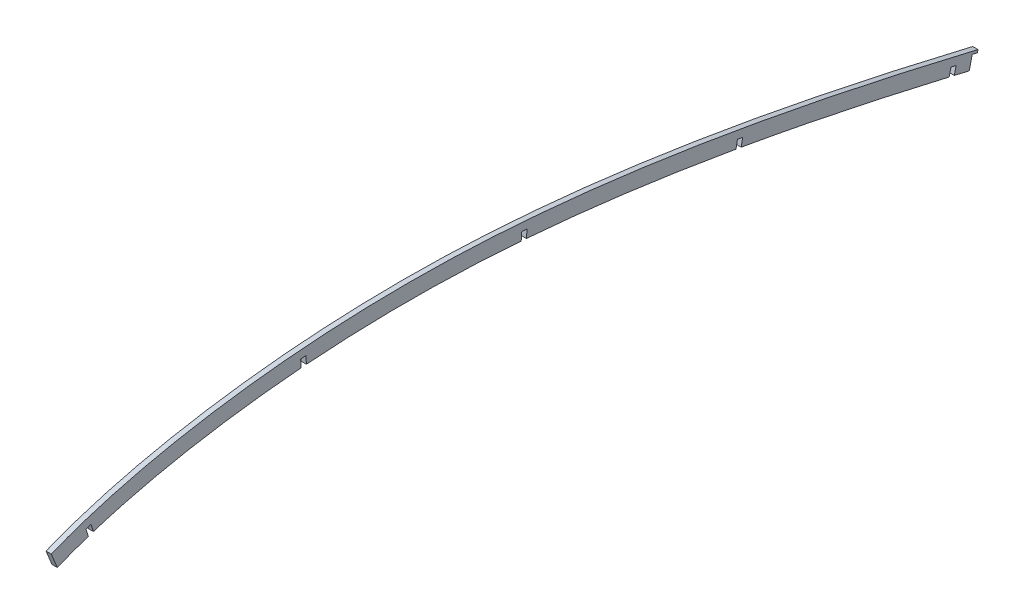
ISO-10303-21;
HEADER;
FILE_DESCRIPTION(('STEP AP214'),'2;1');
FILE_NAME('part.step','',(''),(''),'','','');
FILE_SCHEMA(('AUTOMOTIVE_DESIGN { 1 0 10303 214 1 1 1 1 }'));
ENDSEC;
DATA;
#1=APPLICATION_CONTEXT('core data for automotive mechanical design processes');
#2=APPLICATION_PROTOCOL_DEFINITION('international standard','automotive_design',2000,#1);
#3=PRODUCT_CONTEXT('',#1,'mechanical');
#4=PRODUCT('Part','Part','',(#3));
#5=PRODUCT_RELATED_PRODUCT_CATEGORY('part','',(#4));
#6=PRODUCT_DEFINITION_FORMATION('','',#4);
#7=PRODUCT_DEFINITION_CONTEXT('part definition',#1,'design');
#8=PRODUCT_DEFINITION('design','',#6,#7);
#9=PRODUCT_DEFINITION_SHAPE('','',#8);
#10=(LENGTH_UNIT() NAMED_UNIT(*) SI_UNIT(.MILLI.,.METRE.));
#11=(NAMED_UNIT(*) PLANE_ANGLE_UNIT() SI_UNIT($,.RADIAN.));
#12=(NAMED_UNIT(*) SI_UNIT($,.STERADIAN.) SOLID_ANGLE_UNIT());
#13=UNCERTAINTY_MEASURE_WITH_UNIT(LENGTH_MEASURE(1.E-05),#10,'distance_accuracy_value','');
#14=(GEOMETRIC_REPRESENTATION_CONTEXT(3) GLOBAL_UNCERTAINTY_ASSIGNED_CONTEXT((#13)) GLOBAL_UNIT_ASSIGNED_CONTEXT((#10,
#11,#12)) REPRESENTATION_CONTEXT('',''));
#15=CARTESIAN_POINT('',(0.,0.,0.));
#16=DIRECTION('',(0.,0.,1.));
#17=DIRECTION('',(1.,0.,0.));
#18=AXIS2_PLACEMENT_3D('',#15,#16,#17);
#19=CARTESIAN_POINT('',(4.7625,17.1396481702244,-615.081577013444));
#20=CARTESIAN_POINT('',(4.7625,17.324101761967,-614.31004075708));
#21=CARTESIAN_POINT('',(4.7625,17.6313826815989,-613.02272569901));
#22=CARTESIAN_POINT('',(4.7625,18.2487119662611,-610.429655878609));
#23=CARTESIAN_POINT('',(4.7625,18.9905644070783,-607.301737757551));
#24=CARTESIAN_POINT('',(4.7625,19.6676709186884,-604.430977557633));
#25=CARTESIAN_POINT('',(4.7625,20.0655873491199,-602.738206819214));
#26=CARTESIAN_POINT('',(4.7625,20.1864008165703,-602.223825862053));
#27=CARTESIAN_POINT('',(4.7625,20.3071495033727,-601.709433105989));
#28=CARTESIAN_POINT('',(4.7625,20.4278013713872,-601.19502045043));
#29=CARTESIAN_POINT('',(4.7625,20.5483560782246,-600.680587504561));
#30=CARTESIAN_POINT('',(4.7625,20.6688463598471,-600.166138967266));
#31=CARTESIAN_POINT('',(4.7625,24.9201900169082,-581.999059093585));
#32=CARTESIAN_POINT('',(4.7625,34.1506676923913,-540.919196670024));
#33=CARTESIAN_POINT('',(4.7625,42.3856818378709,-499.303273759449));
#34=CARTESIAN_POINT('',(4.7625,46.6511408456516,-475.243980176617));
#35=CARTESIAN_POINT('',(4.7625,46.8315584713001,-474.221657710415));
#36=CARTESIAN_POINT('',(4.7625,46.9231090372934,-473.701897287013));
#37=CARTESIAN_POINT('',(4.7625,47.0145431084058,-473.182121106492));
#38=CARTESIAN_POINT('',(4.7625,47.1058035969079,-472.66231773198));
#39=CARTESIAN_POINT('',(4.7625,47.1968899573277,-472.142487148665));
#40=CARTESIAN_POINT('',(4.7625,47.2878606822932,-471.622635441126));
#41=CARTESIAN_POINT('',(4.7625,51.0660147875698,-449.989624610276));
#42=CARTESIAN_POINT('',(4.7625,56.2328478898667,-416.816830973678));
#43=CARTESIAN_POINT('',(4.7625,61.2164451727462,-374.872019839903));
#44=CARTESIAN_POINT('',(4.7625,63.1548209798223,-353.995979819886));
#45=CARTESIAN_POINT('',(4.7625,63.9000628784314,-344.661445546551));
#46=CARTESIAN_POINT('',(4.7625,63.9416943909653,-344.13629062168));
#47=CARTESIAN_POINT('',(4.7625,63.983128432936,-343.611137310043));
#48=CARTESIAN_POINT('',(4.7625,64.0242662658889,-343.085972824958));
#49=CARTESIAN_POINT('',(4.7625,64.0651058861199,-342.560797287529));
#50=CARTESIAN_POINT('',(4.7625,64.1057441305605,-342.035604977305));
#51=CARTESIAN_POINT('',(4.7625,64.2453921107398,-340.217822045263));
#52=CARTESIAN_POINT('',(4.7625,65.2353132909809,-326.855067365178));
#53=CARTESIAN_POINT('',(4.7625,66.5731008453839,-302.084501399625));
#54=CARTESIAN_POINT('',(4.7625,67.0295113914138,-267.019938728509));
#55=CARTESIAN_POINT('',(4.7625,66.1868395413679,-237.191430937633));
#56=CARTESIAN_POINT('',(4.7625,65.0235561698412,-218.836761563478));
#57=CARTESIAN_POINT('',(4.7625,64.4961586650393,-212.001250995257));
#58=CARTESIAN_POINT('',(4.7625,64.4552929038934,-211.477067656619));
#59=CARTESIAN_POINT('',(4.7625,64.4141471078354,-210.952908875283));
#60=CARTESIAN_POINT('',(4.7625,64.3725811626279,-210.428784482618));
#61=CARTESIAN_POINT('',(4.7625,64.3305948952132,-209.904694861626));
#62=CARTESIAN_POINT('',(4.7625,64.2883286260672,-209.380627113175));
#63=CARTESIAN_POINT('',(4.7625,63.9408062613876,-205.114508770519));
#64=CARTESIAN_POINT('',(4.7625,62.5257172479679,-189.368914799697));
#65=CARTESIAN_POINT('',(4.7625,59.2266460994478,-162.355837104917));
#66=CARTESIAN_POINT('',(4.7625,54.2189832741619,-133.710472046701));
#67=CARTESIAN_POINT('',(4.7625,49.1352731501984,-111.101045047003));
#68=CARTESIAN_POINT('',(4.7625,45.269363386815,-96.4575401159779));
#69=CARTESIAN_POINT('',(4.7625,42.4990095916299,-87.2714812967859));
#70=CARTESIAN_POINT('',(4.7625,41.291624229938,-83.4946906040885));
#71=CARTESIAN_POINT('',(4.7625,41.13184165472,-82.9978032393506));
#72=CARTESIAN_POINT('',(4.7625,40.9715166419302,-82.5011777331781));
#73=CARTESIAN_POINT('',(4.7625,40.81035261586,-82.0048805211973));
#74=CARTESIAN_POINT('',(4.7625,40.6483417003848,-81.5089146046762));
#75=CARTESIAN_POINT('',(4.7625,40.485749442758,-81.0131312437216));
#76=CARTESIAN_POINT('',(4.7625,40.0952216405408,-79.8293397660172));
#77=CARTESIAN_POINT('',(4.7625,38.8298013612575,-76.0583495341878));
#78=CARTESIAN_POINT('',(4.7625,36.6322495027938,-69.8711355096253));
#79=CARTESIAN_POINT('',(4.7625,34.5747864106629,-64.588433246179));
#80=CARTESIAN_POINT('',(4.7625,33.4984403336222,-61.9608185824151));
#81=B_SPLINE_CURVE_WITH_KNOTS('',3,(#19,#20,#21,#22,#23,#24,#25,#26,#27,#28,#29,#30,#31,#32,#33,
#34,#35,#36,#37,#38,#39,#40,#41,#42,#43,#44,#45,#46,#47,#48,#49,#50,#51,#52,#53,#54,#55,#56,#57,
#58,#59,#60,#61,#62,#63,#64,#65,#66,#67,#68,#69,#70,#71,#72,#73,#74,#75,#76,#77,#78,#79,#80),
.UNSPECIFIED.,.F.,.F.,(4,1,1,1,1,1,1,1,1,1,1,1,1,1,1,1,1,1,1,1,1,1,1,1,1,1,1,1,1,1,1,1,1,1,1,1,
1,1,1,1,1,1,1,1,1,1,1,1,1,1,1,1,1,1,1,1,1,1,1,4),(0.235495016722039,0.238358810296295,
0.240268006012465,0.245112823152076,0.249957640291687,0.250910967115054,0.251387630526738,
0.251864293938422,0.252817620761789,0.253294295124641,0.253770969487493,0.254724310912419,
0.320624379271665,0.405753741821292,0.408077678674949,0.409032468228454,0.409509863005206,
0.409987257781958,0.410942047335462,0.411419458298466,0.411896869261471,0.412851680396645,
0.490883104370919,0.533447785645732,0.566036483443328,0.566993588228304,0.567472140620791,
0.567950693013279,0.568907797798254,0.569386403540351,0.569865009282448,0.570822185200236,
0.576012466920546,0.618577148195359,0.661141829470172,0.703706510744986,0.727290053126239,
0.72824955938757,0.728729312518236,0.729209065648901,0.730168571910233,0.730648333767204,
0.731128095624175,0.732087613520581,0.746271192019799,0.788835873294612,0.831400554569426,
0.852682895206832,0.873965235844239,0.887225542532381,0.888194158520526,0.888678466514598,
0.88916277450867,0.890131390496814,0.890615957659562,0.89110052482231,0.892069486368688,
0.895247576481646,0.905888746800349,0.916529917119052),.UNSPECIFIED.);
#82=DIRECTION('',(-1.,0.,0.));
#83=VECTOR('',#82,1.);
#84=SURFACE_OF_LINEAR_EXTRUSION('',#81,#83);
#85=CARTESIAN_POINT('',(1.5875,17.1396481702244,-615.081577013444));
#86=CARTESIAN_POINT('',(1.5875,17.324101761967,-614.31004075708));
#87=CARTESIAN_POINT('',(1.5875,17.6313826815989,-613.02272569901));
#88=CARTESIAN_POINT('',(1.5875,18.2487119662611,-610.429655878609));
#89=CARTESIAN_POINT('',(1.5875,18.9905644070783,-607.301737757551));
#90=CARTESIAN_POINT('',(1.5875,19.6676709186884,-604.430977557633));
#91=CARTESIAN_POINT('',(1.5875,20.0655873491199,-602.738206819214));
#92=CARTESIAN_POINT('',(1.5875,20.1864008165703,-602.223825862053));
#93=CARTESIAN_POINT('',(1.5875,20.3071495033727,-601.709433105989));
#94=CARTESIAN_POINT('',(1.5875,20.4278013713872,-601.19502045043));
#95=CARTESIAN_POINT('',(1.5875,20.5483560782246,-600.680587504561));
#96=CARTESIAN_POINT('',(1.5875,20.6688463598471,-600.166138967266));
#97=CARTESIAN_POINT('',(1.5875,24.9201900169082,-581.999059093585));
#98=CARTESIAN_POINT('',(1.5875,34.1506676923913,-540.919196670024));
#99=CARTESIAN_POINT('',(1.5875,42.3856818378709,-499.303273759449));
#100=CARTESIAN_POINT('',(1.5875,46.6511408456516,-475.243980176617));
#101=CARTESIAN_POINT('',(1.5875,46.8315584713001,-474.221657710415));
#102=CARTESIAN_POINT('',(1.5875,46.9231090372934,-473.701897287013));
#103=CARTESIAN_POINT('',(1.5875,47.0145431084058,-473.182121106492));
#104=CARTESIAN_POINT('',(1.5875,47.1058035969079,-472.66231773198));
#105=CARTESIAN_POINT('',(1.5875,47.1968899573277,-472.142487148665));
#106=CARTESIAN_POINT('',(1.5875,47.2878606822932,-471.622635441126));
#107=CARTESIAN_POINT('',(1.5875,51.0660147875698,-449.989624610276));
#108=CARTESIAN_POINT('',(1.5875,56.2328478898667,-416.816830973678));
#109=CARTESIAN_POINT('',(1.5875,61.2164451727462,-374.872019839903));
#110=CARTESIAN_POINT('',(1.5875,63.1548209798223,-353.995979819886));
#111=CARTESIAN_POINT('',(1.5875,63.9000628784314,-344.661445546551));
#112=CARTESIAN_POINT('',(1.5875,63.9416943909653,-344.13629062168));
#113=CARTESIAN_POINT('',(1.5875,63.983128432936,-343.611137310043));
#114=CARTESIAN_POINT('',(1.5875,64.0242662658889,-343.085972824958));
#115=CARTESIAN_POINT('',(1.5875,64.0651058861199,-342.560797287529));
#116=CARTESIAN_POINT('',(1.5875,64.1057441305605,-342.035604977305));
#117=CARTESIAN_POINT('',(1.5875,64.2453921107398,-340.217822045263));
#118=CARTESIAN_POINT('',(1.5875,65.2353132909809,-326.855067365178));
#119=CARTESIAN_POINT('',(1.5875,66.5731008453839,-302.084501399625));
#120=CARTESIAN_POINT('',(1.5875,67.0295113914138,-267.019938728509));
#121=CARTESIAN_POINT('',(1.5875,66.1868395413679,-237.191430937633));
#122=CARTESIAN_POINT('',(1.5875,65.0235561698412,-218.836761563478));
#123=CARTESIAN_POINT('',(1.5875,64.4961586650393,-212.001250995257));
#124=CARTESIAN_POINT('',(1.5875,64.4552929038934,-211.477067656619));
#125=CARTESIAN_POINT('',(1.5875,64.4141471078354,-210.952908875283));
#126=CARTESIAN_POINT('',(1.5875,64.3725811626279,-210.428784482618));
#127=CARTESIAN_POINT('',(1.5875,64.3305948952132,-209.904694861626));
#128=CARTESIAN_POINT('',(1.5875,64.2883286260672,-209.380627113175));
#129=CARTESIAN_POINT('',(1.5875,63.9408062613876,-205.114508770519));
#130=CARTESIAN_POINT('',(1.5875,62.5257172479679,-189.368914799697));
#131=CARTESIAN_POINT('',(1.5875,59.2266460994478,-162.355837104917));
#132=CARTESIAN_POINT('',(1.5875,54.2189832741619,-133.710472046701));
#133=CARTESIAN_POINT('',(1.5875,49.1352731501984,-111.101045047003));
#134=CARTESIAN_POINT('',(1.5875,45.269363386815,-96.4575401159779));
#135=CARTESIAN_POINT('',(1.5875,42.4990095916299,-87.2714812967859));
#136=CARTESIAN_POINT('',(1.5875,41.291624229938,-83.4946906040885));
#137=CARTESIAN_POINT('',(1.5875,41.13184165472,-82.9978032393506));
#138=CARTESIAN_POINT('',(1.5875,40.9715166419302,-82.5011777331781));
#139=CARTESIAN_POINT('',(1.5875,40.81035261586,-82.0048805211973));
#140=CARTESIAN_POINT('',(1.5875,40.6483417003848,-81.5089146046762));
#141=CARTESIAN_POINT('',(1.5875,40.485749442758,-81.0131312437216));
#142=CARTESIAN_POINT('',(1.5875,40.0952216405408,-79.8293397660172));
#143=CARTESIAN_POINT('',(1.5875,38.8298013612575,-76.0583495341878));
#144=CARTESIAN_POINT('',(1.5875,36.6322495027938,-69.8711355096253));
#145=CARTESIAN_POINT('',(1.5875,34.5747864106629,-64.588433246179));
#146=CARTESIAN_POINT('',(1.5875,33.4984403336222,-61.9608185824151));
#147=B_SPLINE_CURVE_WITH_KNOTS('',3,(#85,#86,#87,#88,#89,#90,#91,#92,#93,#94,#95,#96,#97,#98,
#99,#100,#101,#102,#103,#104,#105,#106,#107,#108,#109,#110,#111,#112,#113,#114,#115,#116,#117,
#118,#119,#120,#121,#122,#123,#124,#125,#126,#127,#128,#129,#130,#131,#132,#133,#134,#135,#136,
#137,#138,#139,#140,#141,#142,#143,#144,#145,#146),.UNSPECIFIED.,.F.,.F.,(4,1,1,1,1,1,1,1,1,1,1,
1,1,1,1,1,1,1,1,1,1,1,1,1,1,1,1,1,1,1,1,1,1,1,1,1,1,1,1,1,1,1,1,1,1,1,1,1,1,1,1,1,1,1,1,1,1,1,1,
4),(0.235495016722039,0.238358810296295,0.240268006012465,0.245112823152076,0.249957640291687,
0.250910967115054,0.251387630526738,0.251864293938422,0.252817620761789,0.253294295124641,
0.253770969487493,0.254724310912419,0.320624379271665,0.405753741821292,0.408077678674949,
0.409032468228454,0.409509863005206,0.409987257781958,0.410942047335462,0.411419458298466,
0.411896869261471,0.412851680396645,0.490883104370919,0.533447785645732,0.566036483443328,
0.566993588228304,0.567472140620791,0.567950693013279,0.568907797798254,0.569386403540351,
0.569865009282448,0.570822185200236,0.576012466920546,0.618577148195359,0.661141829470172,
0.703706510744986,0.727290053126239,0.72824955938757,0.728729312518236,0.729209065648901,
0.730168571910233,0.730648333767204,0.731128095624175,0.732087613520581,0.746271192019799,
0.788835873294612,0.831400554569426,0.852682895206832,0.873965235844239,0.887225542532381,
0.888194158520526,0.888678466514598,0.88916277450867,0.890131390496814,0.890615957659562,
0.89110052482231,0.892069486368688,0.895247576481646,0.905888746800349,0.916529917119052),.UNSPECIFIED.);
#148=CARTESIAN_POINT('',(1.5875,17.8764365250896,-611.993248956608));
#149=VERTEX_POINT('',#148);
#150=CARTESIAN_POINT('',(1.5875,20.0051241463908,-602.995386693206));
#151=VERTEX_POINT('',#150);
#152=EDGE_CURVE('E236',#149,#151,#147,.T.);
#153=ORIENTED_EDGE('',*,*,#152,.F.);
#154=DIRECTION('',(-1.,0.,0.));
#155=VECTOR('',#154,1.);
#156=CARTESIAN_POINT('',(4.7625,17.8764365250896,-611.993248956608));
#157=LINE('',#156,#155);
#158=CARTESIAN_POINT('',(4.7625,17.8764365250896,-611.993248956608));
#159=VERTEX_POINT('',#158);
#160=EDGE_CURVE('E11',#159,#149,#157,.T.);
#161=ORIENTED_EDGE('',*,*,#160,.F.);
#162=CARTESIAN_POINT('',(4.7625,20.0051241463908,-602.995386693206));
#163=VERTEX_POINT('',#162);
#164=EDGE_CURVE('E309',#159,#163,#81,.T.);
#165=ORIENTED_EDGE('',*,*,#164,.T.);
#166=DIRECTION('',(-1.,0.,0.));
#167=VECTOR('',#166,1.);
#168=CARTESIAN_POINT('',(4.7625,20.0051241463908,-602.995386693206));
#169=LINE('',#168,#167);
#170=EDGE_CURVE('E140',#163,#151,#169,.T.);
#171=ORIENTED_EDGE('',*,*,#170,.T.);
#172=EDGE_LOOP('',(#153,#161,#165,#171));
#173=FACE_BOUND('',#172,.T.);
#174=ADVANCED_FACE('F35',(#173),#84,.T.);
#175=CARTESIAN_POINT('',(4.7625,-137.434214768461,-574.862644619207));
#176=DIRECTION('',(0.,-0.232520498212296,-0.972591495907252));
#177=DIRECTION('',(0.,0.972591495907252,-0.232520498212296));
#178=AXIS2_PLACEMENT_3D('',#175,#176,#177);
#179=PLANE('',#178);
#180=DIRECTION('',(0.,-0.972591495907252,0.232520498212296));
#181=VECTOR('',#180,1.);
#182=CARTESIAN_POINT('',(1.5875,-137.434214768461,-574.862644619207));
#183=LINE('',#182,#181);
#184=CARTESIAN_POINT('',(1.5875,25.5978457508124,-613.839230468497));
#185=VERTEX_POINT('',#184);
#186=EDGE_CURVE('E241',#185,#149,#183,.T.);
#187=ORIENTED_EDGE('',*,*,#186,.F.);
#188=DIRECTION('',(-1.,0.,0.));
#189=VECTOR('',#188,1.);
#190=CARTESIAN_POINT('',(4.7625,25.5978457508124,-613.839230468497));
#191=LINE('',#190,#189);
#192=CARTESIAN_POINT('',(4.7625,25.5978457508124,-613.839230468497));
#193=VERTEX_POINT('',#192);
#194=EDGE_CURVE('E44',#193,#185,#191,.T.);
#195=ORIENTED_EDGE('',*,*,#194,.F.);
#196=DIRECTION('',(0.,-0.972591495907252,0.232520498212296));
#197=VECTOR('',#196,1.);
#198=CARTESIAN_POINT('',(4.7625,-137.434214768461,-574.862644619207));
#199=LINE('',#198,#197);
#200=EDGE_CURVE('E374',#193,#159,#199,.T.);
#201=ORIENTED_EDGE('',*,*,#200,.T.);
#202=ORIENTED_EDGE('',*,*,#160,.T.);
#203=EDGE_LOOP('',(#187,#195,#201,#202));
#204=FACE_BOUND('',#203,.T.);
#205=ADVANCED_FACE('F37',(#204),#179,.T.);
#206=CARTESIAN_POINT('',(4.7625,163.032060519282,-38.9765858492951));
#207=DIRECTION('',(0.,-0.972591495907248,0.232520498212311));
#208=DIRECTION('',(0.,-0.232520498212312,-0.972591495907248));
#209=AXIS2_PLACEMENT_3D('',#206,#207,#208);
#210=PLANE('',#209);
#211=DIRECTION('',(0.,0.232520498212311,0.972591495907248));
#212=VECTOR('',#211,1.);
#213=CARTESIAN_POINT('',(1.5875,163.032060519282,-38.9765858492951));
#214=LINE('',#213,#212);
#215=CARTESIAN_POINT('',(1.5875,24.8595931689883,-616.927208468003));
#216=VERTEX_POINT('',#215);
#217=EDGE_CURVE('E249',#216,#185,#214,.T.);
#218=ORIENTED_EDGE('',*,*,#217,.F.);
#219=DIRECTION('',(-1.,0.,0.));
#220=VECTOR('',#219,1.);
#221=CARTESIAN_POINT('',(4.7625,24.8595931689883,-616.927208468003));
#222=LINE('',#221,#220);
#223=CARTESIAN_POINT('',(4.7625,24.8595931689883,-616.927208468003));
#224=VERTEX_POINT('',#223);
#225=EDGE_CURVE('E352',#224,#216,#222,.T.);
#226=ORIENTED_EDGE('',*,*,#225,.F.);
#227=DIRECTION('',(0.,0.232520498212311,0.972591495907248));
#228=VECTOR('',#227,1.);
#229=CARTESIAN_POINT('',(4.7625,163.032060519282,-38.9765858492951));
#230=LINE('',#229,#228);
#231=EDGE_CURVE('E359',#224,#193,#230,.T.);
#232=ORIENTED_EDGE('',*,*,#231,.T.);
#233=ORIENTED_EDGE('',*,*,#194,.T.);
#234=EDGE_LOOP('',(#218,#226,#232,#233));
#235=FACE_BOUND('',#234,.T.);
#236=ADVANCED_FACE('F357',(#235),#210,.T.);
#237=CARTESIAN_POINT('',(4.7625,-138.172467350251,-577.950622618732));
#238=DIRECTION('',(0.,-0.232520498212234,-0.972591495907267));
#239=DIRECTION('',(0.,0.972591495907267,-0.232520498212234));
#240=AXIS2_PLACEMENT_3D('',#237,#238,#239);
#241=PLANE('',#240);
#242=DIRECTION('',(0.,-0.972591495907267,0.232520498212234));
#243=VECTOR('',#242,1.);
#244=CARTESIAN_POINT('',(1.5875,-138.172467350251,-577.950622618732));
#245=LINE('',#244,#243);
#246=CARTESIAN_POINT('',(1.5875,26.4035821687411,-617.296334758915));
#247=VERTEX_POINT('',#246);
#248=EDGE_CURVE('E252',#247,#216,#245,.T.);
#249=ORIENTED_EDGE('',*,*,#248,.F.);
#250=DIRECTION('',(-1.,0.,0.));
#251=VECTOR('',#250,1.);
#252=CARTESIAN_POINT('',(4.7625,26.4035821687411,-617.296334758915));
#253=LINE('',#252,#251);
#254=CARTESIAN_POINT('',(4.7625,26.4035821687411,-617.296334758915));
#255=VERTEX_POINT('',#254);
#256=EDGE_CURVE('E350',#255,#247,#253,.T.);
#257=ORIENTED_EDGE('',*,*,#256,.F.);
#258=DIRECTION('',(0.,-0.972591495907267,0.232520498212234));
#259=VECTOR('',#258,1.);
#260=CARTESIAN_POINT('',(4.7625,-138.172467350251,-577.950622618732));
#261=LINE('',#260,#259);
#262=EDGE_CURVE('E373',#255,#224,#261,.T.);
#263=ORIENTED_EDGE('',*,*,#262,.T.);
#264=ORIENTED_EDGE('',*,*,#225,.T.);
#265=EDGE_LOOP('',(#249,#257,#263,#264));
#266=FACE_BOUND('',#265,.T.);
#267=ADVANCED_FACE('F369',(#266),#241,.T.);
#268=CARTESIAN_POINT('',(4.7625,26.4035821687409,-617.296334758916));
#269=CARTESIAN_POINT('',(4.7625,26.9085124824443,-615.18430191489));
#270=CARTESIAN_POINT('',(4.7625,27.9142873331992,-610.959288876388));
#271=CARTESIAN_POINT('',(4.7625,32.8296317764442,-590.127541527268));
#272=CARTESIAN_POINT('',(4.7625,40.9138550143784,-554.428003339115));
#273=CARTESIAN_POINT('',(4.7625,51.3185939323861,-503.686138005634));
#274=CARTESIAN_POINT('',(4.7625,60.4658299911952,-452.392596730844));
#275=CARTESIAN_POINT('',(4.7625,67.9850158715227,-400.843471228535));
#276=CARTESIAN_POINT('',(4.7625,72.589063506653,-357.679132334803));
#277=CARTESIAN_POINT('',(4.7625,75.0502992601972,-323.056220781977));
#278=CARTESIAN_POINT('',(4.7625,76.5084412814493,-288.383000879313));
#279=CARTESIAN_POINT('',(4.7625,76.4258344387279,-253.666561863253));
#280=CARTESIAN_POINT('',(4.7625,74.7030652583376,-219.009987110002));
#281=CARTESIAN_POINT('',(4.7625,72.5121701681067,-193.082327137128));
#282=CARTESIAN_POINT('',(4.7625,69.4104125606429,-167.246128756063));
#283=CARTESIAN_POINT('',(4.7625,65.3542372922387,-141.548940999441));
#284=CARTESIAN_POINT('',(4.7625,60.2087185191181,-116.056003419049));
#285=CARTESIAN_POINT('',(4.7625,54.8510338693566,-95.0650929293049));
#286=CARTESIAN_POINT('',(4.7625,49.7752792079317,-78.5122882334403));
#287=CARTESIAN_POINT('',(4.7625,46.3494860287796,-68.6760823858227));
#288=CARTESIAN_POINT('',(4.7625,43.7825244258323,-61.9863205400274));
#289=CARTESIAN_POINT('',(4.7625,42.7219223278424,-59.3495011227662));
#290=CARTESIAN_POINT('',(4.7625,42.3126133502946,-58.3502813603158));
#291=B_SPLINE_CURVE_WITH_KNOTS('',3,(#268,#269,#270,#271,#272,#273,#274,#275,#276,#277,#278,
#279,#280,#281,#282,#283,#284,#285,#286,#287,#288,#289,#290),.UNSPECIFIED.,.F.,.F.,(4,1,1,1,1,1,
1,1,1,1,1,1,1,1,1,1,1,1,1,1,4),(0.235495016722039,0.24330751672204,0.25112001672204,0.3125,
0.375,0.4375,0.5,0.5625,0.59375,0.625,0.6875,0.71875,0.75,0.78125,0.8125,0.84375,0.875,0.890625,
0.90625,0.912623667119052,0.916529917119052),.UNSPECIFIED.);
#292=DIRECTION('',(-1.,0.,0.));
#293=VECTOR('',#292,1.);
#294=SURFACE_OF_LINEAR_EXTRUSION('',#291,#293);
#295=CARTESIAN_POINT('',(1.5875,26.4035821687409,-617.296334758916));
#296=CARTESIAN_POINT('',(1.5875,26.9085124824443,-615.18430191489));
#297=CARTESIAN_POINT('',(1.5875,27.9142873331992,-610.959288876388));
#298=CARTESIAN_POINT('',(1.5875,32.8296317764442,-590.127541527268));
#299=CARTESIAN_POINT('',(1.5875,40.9138550143784,-554.428003339115));
#300=CARTESIAN_POINT('',(1.5875,51.3185939323861,-503.686138005634));
#301=CARTESIAN_POINT('',(1.5875,60.4658299911952,-452.392596730844));
#302=CARTESIAN_POINT('',(1.5875,67.9850158715227,-400.843471228535));
#303=CARTESIAN_POINT('',(1.5875,72.589063506653,-357.679132334803));
#304=CARTESIAN_POINT('',(1.5875,75.0502992601972,-323.056220781977));
#305=CARTESIAN_POINT('',(1.5875,76.5084412814493,-288.383000879313));
#306=CARTESIAN_POINT('',(1.5875,76.4258344387279,-253.666561863253));
#307=CARTESIAN_POINT('',(1.5875,74.7030652583376,-219.009987110002));
#308=CARTESIAN_POINT('',(1.5875,72.5121701681067,-193.082327137128));
#309=CARTESIAN_POINT('',(1.5875,69.4104125606429,-167.246128756063));
#310=CARTESIAN_POINT('',(1.5875,65.3542372922387,-141.548940999441));
#311=CARTESIAN_POINT('',(1.5875,60.2087185191181,-116.056003419049));
#312=CARTESIAN_POINT('',(1.5875,54.8510338693566,-95.0650929293049));
#313=CARTESIAN_POINT('',(1.5875,49.7752792079317,-78.5122882334403));
#314=CARTESIAN_POINT('',(1.5875,46.3494860287796,-68.6760823858227));
#315=CARTESIAN_POINT('',(1.5875,43.7825244258323,-61.9863205400274));
#316=CARTESIAN_POINT('',(1.5875,42.7219223278424,-59.3495011227662));
#317=CARTESIAN_POINT('',(1.5875,42.3126133502946,-58.3502813603158));
#318=B_SPLINE_CURVE_WITH_KNOTS('',3,(#295,#296,#297,#298,#299,#300,#301,#302,#303,#304,#305,
#306,#307,#308,#309,#310,#311,#312,#313,#314,#315,#316,#317),.UNSPECIFIED.,.F.,.F.,(4,1,1,1,1,1,
1,1,1,1,1,1,1,1,1,1,1,1,1,1,4),(0.235495016722039,0.24330751672204,0.25112001672204,0.3125,
0.375,0.4375,0.5,0.5625,0.59375,0.625,0.6875,0.71875,0.75,0.78125,0.8125,0.84375,0.875,0.890625,
0.90625,0.912623667119052,0.916529917119052),.UNSPECIFIED.);
#319=CARTESIAN_POINT('',(1.5875,42.3126133502946,-58.3502813603158));
#320=VERTEX_POINT('',#319);
#321=EDGE_CURVE('E255',#247,#320,#318,.T.);
#322=ORIENTED_EDGE('',*,*,#321,.T.);
#323=DIRECTION('',(-1.,0.,0.));
#324=VECTOR('',#323,1.);
#325=CARTESIAN_POINT('',(4.7625,42.3126133502946,-58.3502813603158));
#326=LINE('',#325,#324);
#327=CARTESIAN_POINT('',(4.7625,42.3126133502946,-58.3502813603158));
#328=VERTEX_POINT('',#327);
#329=EDGE_CURVE('E347',#328,#320,#326,.T.);
#330=ORIENTED_EDGE('',*,*,#329,.F.);
#331=EDGE_CURVE('E376',#255,#328,#291,.T.);
#332=ORIENTED_EDGE('',*,*,#331,.F.);
#333=ORIENTED_EDGE('',*,*,#256,.T.);
#334=EDGE_LOOP('',(#322,#330,#332,#333));
#335=FACE_BOUND('',#334,.T.);
#336=ADVANCED_FACE('F391',(#335),#294,.F.);
#337=CARTESIAN_POINT('',(4.7625,26.5472940564943,-64.8082067970955));
#338=DIRECTION('',(0.,0.37905902594218,-0.925372495188703));
#339=DIRECTION('',(0.,0.925372495188703,0.37905902594218));
#340=AXIS2_PLACEMENT_3D('',#337,#338,#339);
#341=PLANE('',#340);
#342=DIRECTION('',(0.,-0.925372495188703,-0.37905902594218));
#343=VECTOR('',#342,1.);
#344=CARTESIAN_POINT('',(1.5875,26.5472940564943,-64.8082067970955));
#345=LINE('',#344,#343);
#346=CARTESIAN_POINT('',(1.5875,33.4984403336222,-61.9608185824151));
#347=VERTEX_POINT('',#346);
#348=EDGE_CURVE('E259',#320,#347,#345,.T.);
#349=ORIENTED_EDGE('',*,*,#348,.T.);
#350=DIRECTION('',(-1.,0.,0.));
#351=VECTOR('',#350,1.);
#352=CARTESIAN_POINT('',(4.7625,33.4984403336222,-61.9608185824151));
#353=LINE('',#352,#351);
#354=CARTESIAN_POINT('',(4.7625,33.4984403336222,-61.9608185824151));
#355=VERTEX_POINT('',#354);
#356=EDGE_CURVE('E345',#355,#347,#353,.T.);
#357=ORIENTED_EDGE('',*,*,#356,.F.);
#358=DIRECTION('',(0.,-0.925372495188703,-0.37905902594218));
#359=VECTOR('',#358,1.);
#360=CARTESIAN_POINT('',(4.7625,26.5472940564943,-64.8082067970955));
#361=LINE('',#360,#359);
#362=EDGE_CURVE('E385',#328,#355,#361,.T.);
#363=ORIENTED_EDGE('',*,*,#362,.F.);
#364=ORIENTED_EDGE('',*,*,#329,.T.);
#365=EDGE_LOOP('',(#349,#357,#363,#364));
#366=FACE_BOUND('',#365,.T.);
#367=ADVANCED_FACE('F395',(#366),#341,.F.);
#368=CARTESIAN_POINT('',(1.5875,40.4039717377374,-80.7654875918968));
#369=VERTEX_POINT('',#368);
#370=EDGE_CURVE('E243',#369,#347,#147,.T.);
#371=ORIENTED_EDGE('',*,*,#370,.F.);
#372=DIRECTION('',(-1.,0.,0.));
#373=VECTOR('',#372,1.);
#374=CARTESIAN_POINT('',(4.7625,40.4039717377374,-80.7654875918968));
#375=LINE('',#374,#373);
#376=CARTESIAN_POINT('',(4.7625,40.4039717377374,-80.7654875918968));
#377=VERTEX_POINT('',#376);
#378=EDGE_CURVE('E343',#377,#369,#375,.T.);
#379=ORIENTED_EDGE('',*,*,#378,.F.);
#380=EDGE_CURVE('E488',#377,#355,#81,.T.);
#381=ORIENTED_EDGE('',*,*,#380,.T.);
#382=ORIENTED_EDGE('',*,*,#356,.T.);
#383=EDGE_LOOP('',(#371,#379,#381,#382));
#384=FACE_BOUND('',#383,.T.);
#385=ADVANCED_FACE('F405',(#384),#84,.T.);
#386=CARTESIAN_POINT('',(4.7625,27.9951888897091,-84.8591669458729));
#387=DIRECTION('',(0.,0.31329332438465,-0.949656407810748));
#388=DIRECTION('',(0.,0.949656407810748,0.31329332438465));
#389=AXIS2_PLACEMENT_3D('',#386,#387,#388);
#390=PLANE('',#389);
#391=DIRECTION('',(0.,-0.949656407810748,-0.31329332438465));
#392=VECTOR('',#391,1.);
#393=CARTESIAN_POINT('',(1.5875,27.9951888897091,-84.8591669458729));
#394=LINE('',#393,#392);
#395=CARTESIAN_POINT('',(1.5875,44.9302152808249,-79.2722718615281));
#396=VERTEX_POINT('',#395);
#397=EDGE_CURVE('E265',#396,#369,#394,.T.);
#398=ORIENTED_EDGE('',*,*,#397,.F.);
#399=DIRECTION('',(-1.,0.,0.));
#400=VECTOR('',#399,1.);
#401=CARTESIAN_POINT('',(4.7625,44.9302152808249,-79.2722718615281));
#402=LINE('',#401,#400);
#403=CARTESIAN_POINT('',(4.7625,44.9302152808249,-79.2722718615281));
#404=VERTEX_POINT('',#403);
#405=EDGE_CURVE('E341',#404,#396,#402,.T.);
#406=ORIENTED_EDGE('',*,*,#405,.F.);
#407=DIRECTION('',(0.,-0.949656407810748,-0.31329332438465));
#408=VECTOR('',#407,1.);
#409=CARTESIAN_POINT('',(4.7625,27.9951888897091,-84.8591669458729));
#410=LINE('',#409,#408);
#411=EDGE_CURVE('E517',#404,#377,#410,.T.);
#412=ORIENTED_EDGE('',*,*,#411,.T.);
#413=ORIENTED_EDGE('',*,*,#378,.T.);
#414=EDGE_LOOP('',(#398,#406,#412,#413));
#415=FACE_BOUND('',#414,.T.);
#416=ADVANCED_FACE('F412',(#415),#390,.T.);
#417=CARTESIAN_POINT('',(4.7625,17.3572936801903,5.63653319051797));
#418=DIRECTION('',(0.,-0.951107929952075,-0.308858714596625));
#419=DIRECTION('',(0.,0.308858714596625,-0.951107929952075));
#420=AXIS2_PLACEMENT_3D('',#417,#418,#419);
#421=PLANE('',#420);
#422=DIRECTION('',(0.,-0.308858714596625,0.951107929952075));
#423=VECTOR('',#422,1.);
#424=CARTESIAN_POINT('',(1.5875,17.3572936801903,5.63653319051797));
#425=LINE('',#424,#423);
#426=CARTESIAN_POINT('',(1.5875,45.9108416996692,-82.2920395391259));
#427=VERTEX_POINT('',#426);
#428=EDGE_CURVE('E268',#427,#396,#425,.T.);
#429=ORIENTED_EDGE('',*,*,#428,.F.);
#430=DIRECTION('',(-1.,0.,0.));
#431=VECTOR('',#430,1.);
#432=CARTESIAN_POINT('',(4.7625,45.9108416996692,-82.2920395391259));
#433=LINE('',#432,#431);
#434=CARTESIAN_POINT('',(4.7625,45.9108416996692,-82.2920395391259));
#435=VERTEX_POINT('',#434);
#436=EDGE_CURVE('E339',#435,#427,#433,.T.);
#437=ORIENTED_EDGE('',*,*,#436,.F.);
#438=DIRECTION('',(0.,-0.308858714596625,0.951107929952075));
#439=VECTOR('',#438,1.);
#440=CARTESIAN_POINT('',(4.7625,17.3572936801903,5.63653319051797));
#441=LINE('',#440,#439);
#442=EDGE_CURVE('E520',#435,#404,#441,.T.);
#443=ORIENTED_EDGE('',*,*,#442,.T.);
#444=ORIENTED_EDGE('',*,*,#405,.T.);
#445=EDGE_LOOP('',(#429,#437,#443,#444));
#446=FACE_BOUND('',#445,.T.);
#447=ADVANCED_FACE('F465',(#446),#421,.T.);
#448=CARTESIAN_POINT('',(4.7625,28.1254855815355,-87.9778115347763));
#449=DIRECTION('',(0.,0.304506479967863,-0.952510264331877));
#450=DIRECTION('',(0.,0.952510264331877,0.304506479967863));
#451=AXIS2_PLACEMENT_3D('',#448,#449,#450);
#452=PLANE('',#451);
#453=DIRECTION('',(0.,-0.952510264331877,-0.304506479967863));
#454=VECTOR('',#453,1.);
#455=CARTESIAN_POINT('',(1.5875,28.1254855815355,-87.9778115347763));
#456=LINE('',#455,#454);
#457=CARTESIAN_POINT('',(1.5875,41.3710428658422,-83.7433605531));
#458=VERTEX_POINT('',#457);
#459=EDGE_CURVE('E271',#427,#458,#456,.T.);
#460=ORIENTED_EDGE('',*,*,#459,.T.);
#461=DIRECTION('',(-1.,0.,0.));
#462=VECTOR('',#461,1.);
#463=CARTESIAN_POINT('',(4.7625,41.3710428658422,-83.7433605531));
#464=LINE('',#463,#462);
#465=CARTESIAN_POINT('',(4.7625,41.3710428658422,-83.7433605531));
#466=VERTEX_POINT('',#465);
#467=EDGE_CURVE('E337',#466,#458,#464,.T.);
#468=ORIENTED_EDGE('',*,*,#467,.F.);
#469=DIRECTION('',(0.,-0.952510264331877,-0.304506479967863));
#470=VECTOR('',#469,1.);
#471=CARTESIAN_POINT('',(4.7625,28.1254855815355,-87.9778115347763));
#472=LINE('',#471,#470);
#473=EDGE_CURVE('E487',#435,#466,#472,.T.);
#474=ORIENTED_EDGE('',*,*,#473,.F.);
#475=ORIENTED_EDGE('',*,*,#436,.T.);
#476=EDGE_LOOP('',(#460,#468,#474,#475));
#477=FACE_BOUND('',#476,.T.);
#478=ADVANCED_FACE('F457',(#477),#452,.F.);
#479=CARTESIAN_POINT('',(1.5875,64.2669497028958,-209.118614923736));
#480=VERTEX_POINT('',#479);
#481=EDGE_CURVE('E274',#480,#458,#147,.T.);
#482=ORIENTED_EDGE('',*,*,#481,.F.);
#483=DIRECTION('',(-1.,0.,0.));
#484=VECTOR('',#483,1.);
#485=CARTESIAN_POINT('',(4.7625,64.2669497028958,-209.118614923736));
#486=LINE('',#485,#484);
#487=CARTESIAN_POINT('',(4.7625,64.2669497028958,-209.118614923736));
#488=VERTEX_POINT('',#487);
#489=EDGE_CURVE('E335',#488,#480,#486,.T.);
#490=ORIENTED_EDGE('',*,*,#489,.F.);
#491=EDGE_CURVE('E483',#488,#466,#81,.T.);
#492=ORIENTED_EDGE('',*,*,#491,.T.);
#493=ORIENTED_EDGE('',*,*,#467,.T.);
#494=EDGE_LOOP('',(#482,#490,#492,#493));
#495=FACE_BOUND('',#494,.T.);
#496=ADVANCED_FACE('F414',(#495),#84,.T.);
#497=CARTESIAN_POINT('',(4.7625,17.3459494270923,-212.940754558491));
#498=DIRECTION('',(0.,0.0811901137545775,-0.996698633202895));
#499=DIRECTION('',(0.,0.996698633202895,0.0811901137545775));
#500=AXIS2_PLACEMENT_3D('',#497,#498,#499);
#501=PLANE('',#500);
#502=DIRECTION('',(0.,-0.996698633202895,-0.0811901137545775));
#503=VECTOR('',#502,1.);
#504=CARTESIAN_POINT('',(1.5875,17.3459494270923,-212.940754558491));
#505=LINE('',#504,#503);
#506=CARTESIAN_POINT('',(1.5875,69.0154194117086,-208.731809140146));
#507=VERTEX_POINT('',#506);
#508=EDGE_CURVE('E275',#507,#480,#505,.T.);
#509=ORIENTED_EDGE('',*,*,#508,.F.);
#510=DIRECTION('',(-1.,0.,0.));
#511=VECTOR('',#510,1.);
#512=CARTESIAN_POINT('',(4.7625,69.0154194117086,-208.731809140146));
#513=LINE('',#512,#511);
#514=CARTESIAN_POINT('',(4.7625,69.0154194117086,-208.731809140146));
#515=VERTEX_POINT('',#514);
#516=EDGE_CURVE('E333',#515,#507,#513,.T.);
#517=ORIENTED_EDGE('',*,*,#516,.F.);
#518=DIRECTION('',(0.,-0.996698633202895,-0.0811901137545775));
#519=VECTOR('',#518,1.);
#520=CARTESIAN_POINT('',(4.7625,17.3459494270923,-212.940754558491));
#521=LINE('',#520,#519);
#522=EDGE_CURVE('E479',#515,#488,#521,.T.);
#523=ORIENTED_EDGE('',*,*,#522,.T.);
#524=ORIENTED_EDGE('',*,*,#489,.T.);
#525=EDGE_LOOP('',(#509,#517,#523,#524));
#526=FACE_BOUND('',#525,.T.);
#527=ADVANCED_FACE('F456',(#526),#501,.T.);
#528=CARTESIAN_POINT('',(4.7625,52.1339368595567,4.13451101530242));
#529=DIRECTION('',(0.,-0.996870070395248,-0.0790573383701584));
#530=DIRECTION('',(0.,0.0790573383701584,-0.996870070395248));
#531=AXIS2_PLACEMENT_3D('',#528,#529,#530);
#532=PLANE('',#531);
#533=DIRECTION('',(0.,-0.0790573383701584,0.996870070395248));
#534=VECTOR('',#533,1.);
#535=CARTESIAN_POINT('',(1.5875,52.1339368595567,4.13451101530242));
#536=LINE('',#535,#534);
#537=CARTESIAN_POINT('',(1.5875,69.2664264610338,-211.896871613651));
#538=VERTEX_POINT('',#537);
#539=EDGE_CURVE('E278',#538,#507,#536,.T.);
#540=ORIENTED_EDGE('',*,*,#539,.F.);
#541=DIRECTION('',(-1.,0.,0.));
#542=VECTOR('',#541,1.);
#543=CARTESIAN_POINT('',(4.7625,69.2664264610338,-211.896871613651));
#544=LINE('',#543,#542);
#545=CARTESIAN_POINT('',(4.7625,69.2664264610338,-211.896871613651));
#546=VERTEX_POINT('',#545);
#547=EDGE_CURVE('E331',#546,#538,#544,.T.);
#548=ORIENTED_EDGE('',*,*,#547,.F.);
#549=DIRECTION('',(0.,-0.0790573383701584,0.996870070395248));
#550=VECTOR('',#549,1.);
#551=CARTESIAN_POINT('',(4.7625,52.1339368595567,4.13451101530242));
#552=LINE('',#551,#550);
#553=EDGE_CURVE('E482',#546,#515,#552,.T.);
#554=ORIENTED_EDGE('',*,*,#553,.T.);
#555=ORIENTED_EDGE('',*,*,#516,.T.);
#556=EDGE_LOOP('',(#540,#548,#554,#555));
#557=FACE_BOUND('',#556,.T.);
#558=ADVANCED_FACE('F451',(#557),#532,.T.);
#559=CARTESIAN_POINT('',(4.7625,16.662033650402,-215.955559272003));
#560=DIRECTION('',(0.,0.0769262920397286,-0.997036782467437));
#561=DIRECTION('',(0.,0.997036782467437,0.0769262920397286));
#562=AXIS2_PLACEMENT_3D('',#559,#560,#561);
#563=PLANE('',#562);
#564=DIRECTION('',(0.,-0.997036782467437,-0.0769262920397286));
#565=VECTOR('',#564,1.);
#566=CARTESIAN_POINT('',(1.5875,16.662033650402,-215.955559272003));
#567=LINE('',#566,#565);
#568=CARTESIAN_POINT('',(1.5875,64.5163468486301,-212.263363620668));
#569=VERTEX_POINT('',#568);
#570=EDGE_CURVE('E281',#538,#569,#567,.T.);
#571=ORIENTED_EDGE('',*,*,#570,.T.);
#572=DIRECTION('',(-1.,0.,0.));
#573=VECTOR('',#572,1.);
#574=CARTESIAN_POINT('',(4.7625,64.5163468486301,-212.263363620668));
#575=LINE('',#574,#573);
#576=CARTESIAN_POINT('',(4.7625,64.5163468486301,-212.263363620668));
#577=VERTEX_POINT('',#576);
#578=EDGE_CURVE('E329',#577,#569,#575,.T.);
#579=ORIENTED_EDGE('',*,*,#578,.F.);
#580=DIRECTION('',(0.,-0.997036782467437,-0.0769262920397286));
#581=VECTOR('',#580,1.);
#582=CARTESIAN_POINT('',(4.7625,16.662033650402,-215.955559272003));
#583=LINE('',#582,#581);
#584=EDGE_CURVE('E485',#546,#577,#583,.T.);
#585=ORIENTED_EDGE('',*,*,#584,.F.);
#586=ORIENTED_EDGE('',*,*,#547,.T.);
#587=EDGE_LOOP('',(#571,#579,#585,#586));
#588=FACE_BOUND('',#587,.T.);
#589=ADVANCED_FACE('F443',(#588),#563,.F.);
#590=CARTESIAN_POINT('',(1.5875,64.1258913366683,-341.773010519963));
#591=VERTEX_POINT('',#590);
#592=EDGE_CURVE('E284',#591,#569,#147,.T.);
#593=ORIENTED_EDGE('',*,*,#592,.F.);
#594=DIRECTION('',(-1.,0.,0.));
#595=VECTOR('',#594,1.);
#596=CARTESIAN_POINT('',(4.7625,64.1258913366683,-341.773010519963));
#597=LINE('',#596,#595);
#598=CARTESIAN_POINT('',(4.7625,64.1258913366683,-341.773010519963));
#599=VERTEX_POINT('',#598);
#600=EDGE_CURVE('E327',#599,#591,#597,.T.);
#601=ORIENTED_EDGE('',*,*,#600,.F.);
#602=EDGE_CURVE('E489',#599,#577,#81,.T.);
#603=ORIENTED_EDGE('',*,*,#602,.T.);
#604=ORIENTED_EDGE('',*,*,#578,.T.);
#605=EDGE_LOOP('',(#593,#601,#603,#604));
#606=FACE_BOUND('',#605,.T.);
#607=ADVANCED_FACE('F430',(#606),#84,.T.);
#608=CARTESIAN_POINT('',(4.7625,-25.7211542503254,-334.871955716693));
#609=DIRECTION('',(0.,-0.0765833492055163,-0.99706318286479));
#610=DIRECTION('',(0.,0.99706318286479,-0.0765833492055163));
#611=AXIS2_PLACEMENT_3D('',#608,#609,#610);
#612=PLANE('',#611);
#613=DIRECTION('',(0.,-0.99706318286479,0.0765833492055163));
#614=VECTOR('',#613,1.);
#615=CARTESIAN_POINT('',(1.5875,-25.7211542503254,-334.871955716693));
#616=LINE('',#615,#614);
#617=CARTESIAN_POINT('',(1.5875,68.8756007200579,-342.137830582105));
#618=VERTEX_POINT('',#617);
#619=EDGE_CURVE('E285',#618,#591,#616,.T.);
#620=ORIENTED_EDGE('',*,*,#619,.F.);
#621=DIRECTION('',(-1.,0.,0.));
#622=VECTOR('',#621,1.);
#623=CARTESIAN_POINT('',(4.7625,68.8756007200579,-342.137830582105));
#624=LINE('',#623,#622);
#625=CARTESIAN_POINT('',(4.7625,68.8756007200579,-342.137830582105));
#626=VERTEX_POINT('',#625);
#627=EDGE_CURVE('E325',#626,#618,#624,.T.);
#628=ORIENTED_EDGE('',*,*,#627,.F.);
#629=DIRECTION('',(0.,-0.99706318286479,0.0765833492055163));
#630=VECTOR('',#629,1.);
#631=CARTESIAN_POINT('',(4.7625,-25.7211542503254,-334.871955716693));
#632=LINE('',#631,#630);
#633=EDGE_CURVE('E494',#626,#599,#632,.T.);
#634=ORIENTED_EDGE('',*,*,#633,.T.);
#635=ORIENTED_EDGE('',*,*,#600,.T.);
#636=EDGE_LOOP('',(#620,#628,#634,#635));
#637=FACE_BOUND('',#636,.T.);
#638=ADVANCED_FACE('F442',(#637),#612,.T.);
#639=CARTESIAN_POINT('',(4.7625,95.0926618609232,-7.44885646939751));
#640=DIRECTION('',(0.,-0.99694604816147,0.078093386757317));
#641=DIRECTION('',(0.,-0.078093386757317,-0.99694604816147));
#642=AXIS2_PLACEMENT_3D('',#639,#640,#641);
#643=PLANE('',#642);
#644=DIRECTION('',(0.,0.078093386757317,0.99694604816147));
#645=VECTOR('',#644,1.);
#646=CARTESIAN_POINT('',(1.5875,95.0926618609232,-7.44885646939751));
#647=LINE('',#646,#645);
#648=CARTESIAN_POINT('',(1.5875,68.6276542171034,-345.303134285018));
#649=VERTEX_POINT('',#648);
#650=EDGE_CURVE('E288',#649,#618,#647,.T.);
#651=ORIENTED_EDGE('',*,*,#650,.F.);
#652=DIRECTION('',(-1.,0.,0.));
#653=VECTOR('',#652,1.);
#654=CARTESIAN_POINT('',(4.7625,68.6276542171034,-345.303134285018));
#655=LINE('',#654,#653);
#656=CARTESIAN_POINT('',(4.7625,68.6276542171034,-345.303134285018));
#657=VERTEX_POINT('',#656);
#658=EDGE_CURVE('E323',#657,#649,#655,.T.);
#659=ORIENTED_EDGE('',*,*,#658,.F.);
#660=DIRECTION('',(0.,0.078093386757317,0.99694604816147));
#661=VECTOR('',#660,1.);
#662=CARTESIAN_POINT('',(4.7625,95.0926618609232,-7.44885646939751));
#663=LINE('',#662,#661);
#664=EDGE_CURVE('E497',#657,#626,#663,.T.);
#665=ORIENTED_EDGE('',*,*,#664,.T.);
#666=ORIENTED_EDGE('',*,*,#627,.T.);
#667=EDGE_LOOP('',(#651,#659,#665,#666));
#668=FACE_BOUND('',#667,.T.);
#669=ADVANCED_FACE('F437',(#668),#643,.T.);
#670=CARTESIAN_POINT('',(4.7625,-26.9584284031601,-337.671908531404));
#671=DIRECTION('',(0.,-0.0795829391551084,-0.996828247892));
#672=DIRECTION('',(0.,0.996828247892,-0.0795829391551084));
#673=AXIS2_PLACEMENT_3D('',#670,#671,#672);
#674=PLANE('',#673);
#675=DIRECTION('',(0.,-0.996828247892,0.0795829391551084));
#676=VECTOR('',#675,1.);
#677=CARTESIAN_POINT('',(1.5875,-26.9584284031601,-337.671908531404));
#678=LINE('',#677,#676);
#679=CARTESIAN_POINT('',(1.5875,63.8790747386099,-344.924025935601));
#680=VERTEX_POINT('',#679);
#681=EDGE_CURVE('E291',#649,#680,#678,.T.);
#682=ORIENTED_EDGE('',*,*,#681,.T.);
#683=DIRECTION('',(-1.,0.,0.));
#684=VECTOR('',#683,1.);
#685=CARTESIAN_POINT('',(4.7625,63.8790747386099,-344.924025935601));
#686=LINE('',#685,#684);
#687=CARTESIAN_POINT('',(4.7625,63.8790747386099,-344.924025935601));
#688=VERTEX_POINT('',#687);
#689=EDGE_CURVE('E321',#688,#680,#686,.T.);
#690=ORIENTED_EDGE('',*,*,#689,.F.);
#691=DIRECTION('',(0.,-0.996828247892,0.0795829391551084));
#692=VECTOR('',#691,1.);
#693=CARTESIAN_POINT('',(4.7625,-26.9584284031601,-337.671908531404));
#694=LINE('',#693,#692);
#695=EDGE_CURVE('E500',#657,#688,#694,.T.);
#696=ORIENTED_EDGE('',*,*,#695,.F.);
#697=ORIENTED_EDGE('',*,*,#658,.T.);
#698=EDGE_LOOP('',(#682,#690,#696,#697));
#699=FACE_BOUND('',#698,.T.);
#700=ADVANCED_FACE('F428',(#699),#674,.F.);
#701=CARTESIAN_POINT('',(1.5875,47.3332434979194,-471.362696339804));
#702=VERTEX_POINT('',#701);
#703=EDGE_CURVE('E294',#702,#680,#147,.T.);
#704=ORIENTED_EDGE('',*,*,#703,.F.);
#705=DIRECTION('',(-1.,0.,0.));
#706=VECTOR('',#705,1.);
#707=CARTESIAN_POINT('',(4.7625,47.3332434979194,-471.362696339804));
#708=LINE('',#707,#706);
#709=CARTESIAN_POINT('',(4.7625,47.3332434979194,-471.362696339804));
#710=VERTEX_POINT('',#709);
#711=EDGE_CURVE('E319',#710,#702,#708,.T.);
#712=ORIENTED_EDGE('',*,*,#711,.F.);
#713=EDGE_CURVE('E502',#710,#688,#81,.T.);
#714=ORIENTED_EDGE('',*,*,#713,.T.);
#715=ORIENTED_EDGE('',*,*,#689,.T.);
#716=EDGE_LOOP('',(#704,#712,#714,#715));
#717=FACE_BOUND('',#716,.T.);
#718=ADVANCED_FACE('F418',(#717),#84,.T.);
#719=CARTESIAN_POINT('',(4.7625,-78.4848808795304,-449.388805622684));
#720=DIRECTION('',(0.,-0.172043926637628,-0.985089278850961));
#721=DIRECTION('',(0.,0.985089278850961,-0.172043926637628));
#722=AXIS2_PLACEMENT_3D('',#719,#720,#721);
#723=PLANE('',#722);
#724=DIRECTION('',(0.,-0.985089278850961,0.172043926637628));
#725=VECTOR('',#724,1.);
#726=CARTESIAN_POINT('',(1.5875,-78.4848808795304,-449.388805622684));
#727=LINE('',#726,#725);
#728=CARTESIAN_POINT('',(1.5875,52.0254277471999,-472.182177193047));
#729=VERTEX_POINT('',#728);
#730=EDGE_CURVE('E295',#729,#702,#727,.T.);
#731=ORIENTED_EDGE('',*,*,#730,.F.);
#732=DIRECTION('',(-1.,0.,0.));
#733=VECTOR('',#732,1.);
#734=CARTESIAN_POINT('',(4.7625,52.0254277471999,-472.182177193047));
#735=LINE('',#734,#733);
#736=CARTESIAN_POINT('',(4.7625,52.0254277471999,-472.182177193047));
#737=VERTEX_POINT('',#736);
#738=EDGE_CURVE('E317',#737,#729,#735,.T.);
#739=ORIENTED_EDGE('',*,*,#738,.F.);
#740=DIRECTION('',(0.,-0.985089278850961,0.172043926637628));
#741=VECTOR('',#740,1.);
#742=CARTESIAN_POINT('',(4.7625,-78.4848808795304,-449.388805622684));
#743=LINE('',#742,#741);
#744=EDGE_CURVE('E503',#737,#710,#743,.T.);
#745=ORIENTED_EDGE('',*,*,#744,.T.);
#746=ORIENTED_EDGE('',*,*,#711,.T.);
#747=EDGE_LOOP('',(#731,#739,#745,#746));
#748=FACE_BOUND('',#747,.T.);
#749=ADVANCED_FACE('F427',(#748),#723,.T.);
#750=CARTESIAN_POINT('',(4.7625,130.890560069511,-22.9800828388009));
#751=DIRECTION('',(0.,-0.984935466466428,0.172922314628736));
#752=DIRECTION('',(0.,-0.172922314628737,-0.984935466466428));
#753=AXIS2_PLACEMENT_3D('',#750,#751,#752);
#754=PLANE('',#753);
#755=DIRECTION('',(0.,0.172922314628737,0.984935466466428));
#756=VECTOR('',#755,1.);
#757=CARTESIAN_POINT('',(1.5875,130.890560069511,-22.9800828388009));
#758=LINE('',#757,#756);
#759=CARTESIAN_POINT('',(1.5875,51.4763993982536,-475.309347299078));
#760=VERTEX_POINT('',#759);
#761=EDGE_CURVE('E298',#760,#729,#758,.T.);
#762=ORIENTED_EDGE('',*,*,#761,.F.);
#763=DIRECTION('',(-1.,0.,0.));
#764=VECTOR('',#763,1.);
#765=CARTESIAN_POINT('',(4.7625,51.4763993982536,-475.309347299078));
#766=LINE('',#765,#764);
#767=CARTESIAN_POINT('',(4.7625,51.4763993982536,-475.309347299078));
#768=VERTEX_POINT('',#767);
#769=EDGE_CURVE('E315',#768,#760,#766,.T.);
#770=ORIENTED_EDGE('',*,*,#769,.F.);
#771=DIRECTION('',(0.,0.172922314628737,0.984935466466428));
#772=VECTOR('',#771,1.);
#773=CARTESIAN_POINT('',(4.7625,130.890560069511,-22.9800828388009));
#774=LINE('',#773,#772);
#775=EDGE_CURVE('E506',#768,#737,#774,.T.);
#776=ORIENTED_EDGE('',*,*,#775,.T.);
#777=ORIENTED_EDGE('',*,*,#738,.T.);
#778=EDGE_LOOP('',(#762,#770,#776,#777));
#779=FACE_BOUND('',#778,.T.);
#780=ADVANCED_FACE('F423',(#779),#754,.T.);
#781=CARTESIAN_POINT('',(4.7625,-79.7945096194913,-452.142542992057));
#782=DIRECTION('',(0.,-0.173795153964519,-0.984781825816485));
#783=DIRECTION('',(0.,0.984781825816485,-0.173795153964519));
#784=AXIS2_PLACEMENT_3D('',#781,#782,#783);
#785=PLANE('',#784);
#786=DIRECTION('',(0.,-0.984781825816485,0.173795153964519));
#787=VECTOR('',#786,1.);
#788=CARTESIAN_POINT('',(1.5875,-79.7945096194913,-452.142542992057));
#789=LINE('',#788,#787);
#790=CARTESIAN_POINT('',(1.5875,46.7856824748497,-474.481525492729));
#791=VERTEX_POINT('',#790);
#792=EDGE_CURVE('E301',#760,#791,#789,.T.);
#793=ORIENTED_EDGE('',*,*,#792,.T.);
#794=DIRECTION('',(-1.,0.,0.));
#795=VECTOR('',#794,1.);
#796=CARTESIAN_POINT('',(4.7625,46.7856824748497,-474.481525492729));
#797=LINE('',#796,#795);
#798=CARTESIAN_POINT('',(4.7625,46.7856824748497,-474.481525492729));
#799=VERTEX_POINT('',#798);
#800=EDGE_CURVE('E313',#799,#791,#797,.T.);
#801=ORIENTED_EDGE('',*,*,#800,.F.);
#802=DIRECTION('',(0.,-0.984781825816485,0.173795153964519));
#803=VECTOR('',#802,1.);
#804=CARTESIAN_POINT('',(4.7625,-79.7945096194913,-452.142542992057));
#805=LINE('',#804,#803);
#806=EDGE_CURVE('E508',#768,#799,#805,.T.);
#807=ORIENTED_EDGE('',*,*,#806,.F.);
#808=ORIENTED_EDGE('',*,*,#769,.T.);
#809=EDGE_LOOP('',(#793,#801,#807,#808));
#810=FACE_BOUND('',#809,.T.);
#811=ADVANCED_FACE('F416',(#810),#785,.F.);
#812=CARTESIAN_POINT('',(1.5875,20.7290341049092,-599.908904814571));
#813=VERTEX_POINT('',#812);
#814=EDGE_CURVE('E242',#813,#791,#147,.T.);
#815=ORIENTED_EDGE('',*,*,#814,.F.);
#816=DIRECTION('',(-1.,0.,0.));
#817=VECTOR('',#816,1.);
#818=CARTESIAN_POINT('',(4.7625,20.7290341049092,-599.908904814571));
#819=LINE('',#818,#817);
#820=CARTESIAN_POINT('',(4.7625,20.7290341049092,-599.908904814571));
#821=VERTEX_POINT('',#820);
#822=EDGE_CURVE('E223',#821,#813,#819,.T.);
#823=ORIENTED_EDGE('',*,*,#822,.F.);
#824=EDGE_CURVE('E229',#821,#799,#81,.T.);
#825=ORIENTED_EDGE('',*,*,#824,.T.);
#826=ORIENTED_EDGE('',*,*,#800,.T.);
#827=EDGE_LOOP('',(#815,#823,#825,#826));
#828=FACE_BOUND('',#827,.T.);
#829=ADVANCED_FACE('F406',(#828),#84,.T.);
#830=CARTESIAN_POINT('',(4.7625,-132.021777648755,-564.163157437883));
#831=DIRECTION('',(0.,-0.227857618979442,-0.973694462073714));
#832=DIRECTION('',(0.,0.973694462073714,-0.227857618979443));
#833=AXIS2_PLACEMENT_3D('',#830,#831,#832);
#834=PLANE('',#833);
#835=DIRECTION('',(0.,-0.973694462073714,0.227857618979442));
#836=VECTOR('',#835,1.);
#837=CARTESIAN_POINT('',(1.5875,-132.021777648755,-564.163157437883));
#838=LINE('',#837,#836);
#839=CARTESIAN_POINT('',(1.5875,25.3666412849496,-600.99416735941));
#840=VERTEX_POINT('',#839);
#841=EDGE_CURVE('E218',#840,#813,#838,.T.);
#842=ORIENTED_EDGE('',*,*,#841,.F.);
#843=DIRECTION('',(-1.,0.,0.));
#844=VECTOR('',#843,1.);
#845=CARTESIAN_POINT('',(4.7625,25.3666412849496,-600.99416735941));
#846=LINE('',#845,#844);
#847=CARTESIAN_POINT('',(4.7625,25.3666412849496,-600.99416735941));
#848=VERTEX_POINT('',#847);
#849=EDGE_CURVE('E213',#848,#840,#846,.T.);
#850=ORIENTED_EDGE('',*,*,#849,.F.);
#851=DIRECTION('',(0.,-0.973694462073714,0.227857618979442));
#852=VECTOR('',#851,1.);
#853=CARTESIAN_POINT('',(4.7625,-132.021777648755,-564.163157437883));
#854=LINE('',#853,#852);
#855=EDGE_CURVE('E216',#848,#821,#854,.T.);
#856=ORIENTED_EDGE('',*,*,#855,.T.);
#857=ORIENTED_EDGE('',*,*,#822,.T.);
#858=EDGE_LOOP('',(#842,#850,#856,#857));
#859=FACE_BOUND('',#858,.T.);
#860=ADVANCED_FACE('F215',(#859),#834,.T.);
#861=CARTESIAN_POINT('',(4.7625,157.652966821155,-36.9763717624904));
#862=DIRECTION('',(0.,-0.973579998137649,0.228346200376304));
#863=DIRECTION('',(0.,-0.228346200376304,-0.973579998137649));
#864=AXIS2_PLACEMENT_3D('',#861,#862,#863);
#865=PLANE('',#864);
#866=DIRECTION('',(0.,0.228346200376305,0.973579998137649));
#867=VECTOR('',#866,1.);
#868=CARTESIAN_POINT('',(1.5875,157.652966821155,-36.9763717624904));
#869=LINE('',#868,#867);
#870=CARTESIAN_POINT('',(1.5875,24.6416420987548,-604.085283853497));
#871=VERTEX_POINT('',#870);
#872=EDGE_CURVE('E305',#871,#840,#869,.T.);
#873=ORIENTED_EDGE('',*,*,#872,.F.);
#874=DIRECTION('',(-1.,0.,0.));
#875=VECTOR('',#874,1.);
#876=CARTESIAN_POINT('',(4.7625,24.6416420987548,-604.085283853497));
#877=LINE('',#876,#875);
#878=CARTESIAN_POINT('',(4.7625,24.6416420987548,-604.085283853497));
#879=VERTEX_POINT('',#878);
#880=EDGE_CURVE('E133',#879,#871,#877,.T.);
#881=ORIENTED_EDGE('',*,*,#880,.F.);
#882=DIRECTION('',(0.,0.228346200376305,0.973579998137649));
#883=VECTOR('',#882,1.);
#884=CARTESIAN_POINT('',(4.7625,157.652966821155,-36.9763717624904));
#885=LINE('',#884,#883);
#886=EDGE_CURVE('E227',#879,#848,#885,.T.);
#887=ORIENTED_EDGE('',*,*,#886,.T.);
#888=ORIENTED_EDGE('',*,*,#849,.T.);
#889=EDGE_LOOP('',(#873,#881,#887,#888));
#890=FACE_BOUND('',#889,.T.);
#891=ADVANCED_FACE('F231',(#890),#865,.T.);
#892=CARTESIAN_POINT('',(4.7625,-133.275135781872,-566.964097320255));
#893=DIRECTION('',(0.,-0.228830789233262,-0.973466214051049));
#894=DIRECTION('',(0.,0.973466214051049,-0.228830789233262));
#895=AXIS2_PLACEMENT_3D('',#892,#893,#894);
#896=PLANE('',#895);
#897=DIRECTION('',(0.,-0.973466214051049,0.228830789233262));
#898=VECTOR('',#897,1.);
#899=CARTESIAN_POINT('',(1.5875,-133.275135781872,-566.964097320255));
#900=LINE('',#899,#898);
#901=EDGE_CURVE('E307',#871,#151,#900,.T.);
#902=ORIENTED_EDGE('',*,*,#901,.T.);
#903=ORIENTED_EDGE('',*,*,#170,.F.);
#904=DIRECTION('',(0.,-0.973466214051049,0.228830789233262));
#905=VECTOR('',#904,1.);
#906=CARTESIAN_POINT('',(4.7625,-133.275135781872,-566.964097320255));
#907=LINE('',#906,#905);
#908=EDGE_CURVE('E52',#879,#163,#907,.T.);
#909=ORIENTED_EDGE('',*,*,#908,.F.);
#910=ORIENTED_EDGE('',*,*,#880,.T.);
#911=EDGE_LOOP('',(#902,#903,#909,#910));
#912=FACE_BOUND('',#911,.T.);
#913=ADVANCED_FACE('F570',(#912),#896,.F.);
#914=CARTESIAN_POINT('',(4.7625,0.,0.));
#915=DIRECTION('',(1.,0.,0.));
#916=DIRECTION('',(0.,0.,-1.));
#917=AXIS2_PLACEMENT_3D('',#914,#915,#916);
#918=PLANE('',#917);
#919=ORIENTED_EDGE('',*,*,#164,.F.);
#920=ORIENTED_EDGE('',*,*,#200,.F.);
#921=ORIENTED_EDGE('',*,*,#231,.F.);
#922=ORIENTED_EDGE('',*,*,#262,.F.);
#923=ORIENTED_EDGE('',*,*,#331,.T.);
#924=ORIENTED_EDGE('',*,*,#362,.T.);
#925=ORIENTED_EDGE('',*,*,#380,.F.);
#926=ORIENTED_EDGE('',*,*,#411,.F.);
#927=ORIENTED_EDGE('',*,*,#442,.F.);
#928=ORIENTED_EDGE('',*,*,#473,.T.);
#929=ORIENTED_EDGE('',*,*,#491,.F.);
#930=ORIENTED_EDGE('',*,*,#522,.F.);
#931=ORIENTED_EDGE('',*,*,#553,.F.);
#932=ORIENTED_EDGE('',*,*,#584,.T.);
#933=ORIENTED_EDGE('',*,*,#602,.F.);
#934=ORIENTED_EDGE('',*,*,#633,.F.);
#935=ORIENTED_EDGE('',*,*,#664,.F.);
#936=ORIENTED_EDGE('',*,*,#695,.T.);
#937=ORIENTED_EDGE('',*,*,#713,.F.);
#938=ORIENTED_EDGE('',*,*,#744,.F.);
#939=ORIENTED_EDGE('',*,*,#775,.F.);
#940=ORIENTED_EDGE('',*,*,#806,.T.);
#941=ORIENTED_EDGE('',*,*,#824,.F.);
#942=ORIENTED_EDGE('',*,*,#855,.F.);
#943=ORIENTED_EDGE('',*,*,#886,.F.);
#944=ORIENTED_EDGE('',*,*,#908,.T.);
#945=EDGE_LOOP('',(#919,#920,#921,#922,#923,#924,#925,#926,#927,#928,#929,#930,#931,#932,#933,
#934,#935,#936,#937,#938,#939,#940,#941,#942,#943,#944));
#946=FACE_BOUND('',#945,.T.);
#947=ADVANCED_FACE('F226',(#946),#918,.T.);
#948=CARTESIAN_POINT('',(1.5875,0.,0.));
#949=DIRECTION('',(1.,0.,0.));
#950=DIRECTION('',(0.,0.,-1.));
#951=AXIS2_PLACEMENT_3D('',#948,#949,#950);
#952=PLANE('',#951);
#953=ORIENTED_EDGE('',*,*,#152,.T.);
#954=ORIENTED_EDGE('',*,*,#901,.F.);
#955=ORIENTED_EDGE('',*,*,#872,.T.);
#956=ORIENTED_EDGE('',*,*,#841,.T.);
#957=ORIENTED_EDGE('',*,*,#814,.T.);
#958=ORIENTED_EDGE('',*,*,#792,.F.);
#959=ORIENTED_EDGE('',*,*,#761,.T.);
#960=ORIENTED_EDGE('',*,*,#730,.T.);
#961=ORIENTED_EDGE('',*,*,#703,.T.);
#962=ORIENTED_EDGE('',*,*,#681,.F.);
#963=ORIENTED_EDGE('',*,*,#650,.T.);
#964=ORIENTED_EDGE('',*,*,#619,.T.);
#965=ORIENTED_EDGE('',*,*,#592,.T.);
#966=ORIENTED_EDGE('',*,*,#570,.F.);
#967=ORIENTED_EDGE('',*,*,#539,.T.);
#968=ORIENTED_EDGE('',*,*,#508,.T.);
#969=ORIENTED_EDGE('',*,*,#481,.T.);
#970=ORIENTED_EDGE('',*,*,#459,.F.);
#971=ORIENTED_EDGE('',*,*,#428,.T.);
#972=ORIENTED_EDGE('',*,*,#397,.T.);
#973=ORIENTED_EDGE('',*,*,#370,.T.);
#974=ORIENTED_EDGE('',*,*,#348,.F.);
#975=ORIENTED_EDGE('',*,*,#321,.F.);
#976=ORIENTED_EDGE('',*,*,#248,.T.);
#977=ORIENTED_EDGE('',*,*,#217,.T.);
#978=ORIENTED_EDGE('',*,*,#186,.T.);
#979=EDGE_LOOP('',(#953,#954,#955,#956,#957,#958,#959,#960,#961,#962,#963,#964,#965,#966,#967,
#968,#969,#970,#971,#972,#973,#974,#975,#976,#977,#978));
#980=FACE_BOUND('',#979,.T.);
#981=ADVANCED_FACE('F364',(#980),#952,.F.);
#982=CLOSED_SHELL('',(#174,#205,#236,#267,#336,#367,#385,#416,#447,#478,#496,#527,#558,#589,
#607,#638,#669,#700,#718,#749,#780,#811,#829,#860,#891,#913,#947,#981));
#983=MANIFOLD_SOLID_BREP('B2',#982);
#984=ADVANCED_BREP_SHAPE_REPRESENTATION('',(#18,#983),#14);
#985=SHAPE_DEFINITION_REPRESENTATION(#9,#984);
ENDSEC;
END-ISO-10303-21;
